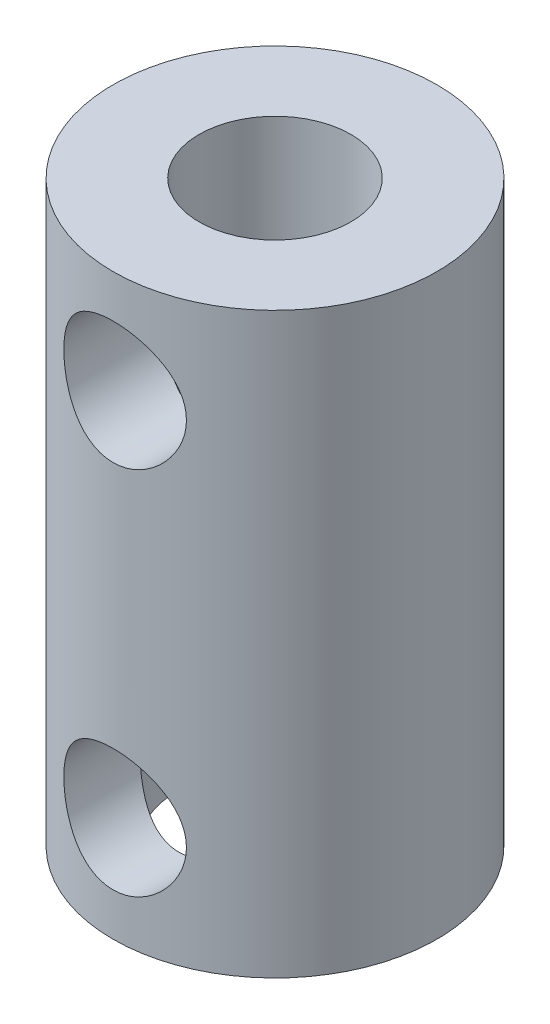
ISO-10303-21;
HEADER;
FILE_DESCRIPTION(('STEP AP214'),'2;1');
FILE_NAME('part.step','',(''),(''),'','','');
FILE_SCHEMA(('AUTOMOTIVE_DESIGN { 1 0 10303 214 1 1 1 1 }'));
ENDSEC;
DATA;
#1=APPLICATION_CONTEXT('core data for automotive mechanical design processes');
#2=APPLICATION_PROTOCOL_DEFINITION('international standard','automotive_design',2000,#1);
#3=PRODUCT_CONTEXT('',#1,'mechanical');
#4=PRODUCT('Part','Part','',(#3));
#5=PRODUCT_RELATED_PRODUCT_CATEGORY('part','',(#4));
#6=PRODUCT_DEFINITION_FORMATION('','',#4);
#7=PRODUCT_DEFINITION_CONTEXT('part definition',#1,'design');
#8=PRODUCT_DEFINITION('design','',#6,#7);
#9=PRODUCT_DEFINITION_SHAPE('','',#8);
#10=(LENGTH_UNIT() NAMED_UNIT(*) SI_UNIT(.MILLI.,.METRE.));
#11=(NAMED_UNIT(*) PLANE_ANGLE_UNIT() SI_UNIT($,.RADIAN.));
#12=(NAMED_UNIT(*) SI_UNIT($,.STERADIAN.) SOLID_ANGLE_UNIT());
#13=UNCERTAINTY_MEASURE_WITH_UNIT(LENGTH_MEASURE(1.E-05),#10,'distance_accuracy_value','');
#14=(GEOMETRIC_REPRESENTATION_CONTEXT(3) GLOBAL_UNCERTAINTY_ASSIGNED_CONTEXT((#13)) GLOBAL_UNIT_ASSIGNED_CONTEXT((#10,
#11,#12)) REPRESENTATION_CONTEXT('',''));
#15=CARTESIAN_POINT('',(0.,0.,0.));
#16=DIRECTION('',(0.,0.,1.));
#17=DIRECTION('',(1.,0.,0.));
#18=AXIS2_PLACEMENT_3D('',#15,#16,#17);
#19=CARTESIAN_POINT('',(0.,19.05,0.));
#20=DIRECTION('',(0.,-1.,0.));
#21=DIRECTION('',(0.,0.,-1.));
#22=AXIS2_PLACEMENT_3D('',#19,#20,#21);
#23=CYLINDRICAL_SURFACE('',#22,5.334);
#24=CARTESIAN_POINT('',(2.01929999999999,3.429,4.93700146951568));
#25=CARTESIAN_POINT('',(2.01930447944565,3.53796644205671,4.93699724405046));
#26=CARTESIAN_POINT('',(2.01045059439056,3.64690370553361,4.94064814854933));
#27=CARTESIAN_POINT('',(1.97543444054489,3.86148882864372,4.95475201963925));
#28=CARTESIAN_POINT('',(1.94927294682313,3.96713683535452,4.96520468163385));
#29=CARTESIAN_POINT('',(1.88074304619809,4.17198278347489,4.99156194094386));
#30=CARTESIAN_POINT('',(1.83841414033231,4.2711957615293,5.00745324054417));
#31=CARTESIAN_POINT('',(1.73889128334471,4.46115102344321,5.04287560500619));
#32=CARTESIAN_POINT('',(1.6816927775262,4.55189070025616,5.06240778458365));
#33=CARTESIAN_POINT('',(1.55095007886271,4.7269220295397,5.10401994332031));
#34=CARTESIAN_POINT('',(1.47677408325426,4.81072382075372,5.12617585427608));
#35=CARTESIAN_POINT('',(1.31552180232292,4.96504478705856,5.16990629793248));
#36=CARTESIAN_POINT('',(1.2284427045076,5.0355610586704,5.19148070266726));
#37=CARTESIAN_POINT('',(1.04012523794396,5.16368183766763,5.23252204526852));
#38=CARTESIAN_POINT('',(0.938499803257827,5.22075210244006,5.25188961400418));
#39=CARTESIAN_POINT('',(0.726227423158126,5.31678227445568,5.28542063488425));
#40=CARTESIAN_POINT('',(0.615583687488662,5.35574859235797,5.29958592879611));
#41=CARTESIAN_POINT('',(0.393566749542693,5.41274137724498,5.32057718322424));
#42=CARTESIAN_POINT('',(0.282438553669896,5.43161158643117,5.32769789450095));
#43=CARTESIAN_POINT('',(0.0583798398278733,5.45058184692518,5.33485652895422));
#44=CARTESIAN_POINT('',(-0.0545500684528993,5.45068811853213,5.33489679931724));
#45=CARTESIAN_POINT('',(-0.272951762873949,5.43261481136873,5.32807636219454));
#46=CARTESIAN_POINT('',(-0.378512558081566,5.41535666378981,5.32156339727964));
#47=CARTESIAN_POINT('',(-0.585111251091154,5.36459681820008,5.30282614548131));
#48=CARTESIAN_POINT('',(-0.686148827388547,5.33109396753274,5.29060145331974));
#49=CARTESIAN_POINT('',(-0.882591199788239,5.24837714092316,5.26142589156488));
#50=CARTESIAN_POINT('',(-0.977891853376849,5.19894029486581,5.24440843901689));
#51=CARTESIAN_POINT('',(-1.15908281530852,5.08595760716204,5.20736477295068));
#52=CARTESIAN_POINT('',(-1.24497004337341,5.02240716770396,5.18733757963256));
#53=CARTESIAN_POINT('',(-1.41031734945089,4.87858128309122,5.14492730665769));
#54=CARTESIAN_POINT('',(-1.48909060289719,4.79753549367529,5.12247495361345));
#55=CARTESIAN_POINT('',(-1.63218972233639,4.62325577623301,5.07869327063848));
#56=CARTESIAN_POINT('',(-1.69651181554814,4.53001867543433,5.05736423508365));
#57=CARTESIAN_POINT('',(-1.81023010786301,4.33124303399592,5.01780263958016));
#58=CARTESIAN_POINT('',(-1.85924901990288,4.22547089829707,4.99965257367589));
#59=CARTESIAN_POINT('',(-1.93851753880741,4.00630460921826,4.96945937974622));
#60=CARTESIAN_POINT('',(-1.96877783080307,3.89291483581017,4.95741277583277));
#61=CARTESIAN_POINT('',(-2.0080927254921,3.66852916571396,4.94161372576153));
#62=CARTESIAN_POINT('',(-2.01824049485177,3.55775511724918,4.93743437273379));
#63=CARTESIAN_POINT('',(-2.02020093934924,3.33603239846786,4.93663342024542));
#64=CARTESIAN_POINT('',(-2.01201832383527,3.22508378031911,4.94000987958409));
#65=CARTESIAN_POINT('',(-1.97854205652086,3.01183186914766,4.95350589275915));
#66=CARTESIAN_POINT('',(-1.95410194104481,2.90937078397479,4.96328872527596));
#67=CARTESIAN_POINT('',(-1.88988298600506,2.71005348440489,4.98809328378995));
#68=CARTESIAN_POINT('',(-1.85010096750629,2.61319843639933,5.00311609548081));
#69=CARTESIAN_POINT('',(-1.75463072385412,2.42375373533398,5.03740860205377));
#70=CARTESIAN_POINT('',(-1.69839621410485,2.3314653892027,5.05681781536739));
#71=CARTESIAN_POINT('',(-1.57219523321136,2.15724747101338,5.09746480725639));
#72=CARTESIAN_POINT('',(-1.50222365366067,2.07532177120689,5.11870326441882));
#73=CARTESIAN_POINT('',(-1.34516894631352,1.91864380219287,5.16227937258415));
#74=CARTESIAN_POINT('',(-1.25727058071108,1.84470087388889,5.18459902436317));
#75=CARTESIAN_POINT('',(-1.06976739053702,1.71251372859965,5.22650650196036));
#76=CARTESIAN_POINT('',(-0.970162473418255,1.65426963573486,5.24609430617899));
#77=CARTESIAN_POINT('',(-0.762084546055993,1.55549649159357,5.28032694944767));
#78=CARTESIAN_POINT('',(-0.65363967819728,1.51491364331945,5.29498676788628));
#79=CARTESIAN_POINT('',(-0.430779322695874,1.45280032542776,5.31775366325145));
#80=CARTESIAN_POINT('',(-0.316366729446474,1.43126070903253,5.32586388589443));
#81=CARTESIAN_POINT('',(-0.0921269840688143,1.40884562792458,5.33431446661301));
#82=CARTESIAN_POINT('',(0.0175700260696666,1.40682107157147,5.33508685186249));
#83=CARTESIAN_POINT('',(0.23567589035579,1.42052681410102,5.32990684279753));
#84=CARTESIAN_POINT('',(0.344084903230242,1.43625490180729,5.32395528598201));
#85=CARTESIAN_POINT('',(0.553754325491232,1.48421010250464,5.3061959436016));
#86=CARTESIAN_POINT('',(0.655126105044459,1.5160107376975,5.29453976881732));
#87=CARTESIAN_POINT('',(0.851099804673821,1.594780504935,5.26659215506921));
#88=CARTESIAN_POINT('',(0.945700438435498,1.64175250979098,5.2502998382871));
#89=CARTESIAN_POINT('',(1.12984126460486,1.75179421046231,5.21384686801513));
#90=CARTESIAN_POINT('',(1.21899691290268,1.81546192263802,5.19355150342232));
#91=CARTESIAN_POINT('',(1.38571137675006,1.9561510808879,5.15157869080139));
#92=CARTESIAN_POINT('',(1.46326600313846,2.03317732918966,5.1299007475314));
#93=CARTESIAN_POINT('',(1.60889417238222,2.20334295835456,5.08616858438968));
#94=CARTESIAN_POINT('',(1.67622898493519,2.29712810269221,5.06415732477682));
#95=CARTESIAN_POINT('',(1.79422016325732,2.49537615296483,5.02356822261871));
#96=CARTESIAN_POINT('',(1.84487417660335,2.59984056223187,5.0049908645041));
#97=CARTESIAN_POINT('',(1.92989734602869,2.82239312636753,4.97285117373348));
#98=CARTESIAN_POINT('',(1.96328114135574,2.94090744590317,4.9596003647767));
#99=CARTESIAN_POINT('',(2.00797225124147,3.18262915575414,4.94168088836879));
#100=CARTESIAN_POINT('',(2.01929493679981,3.30583321744351,4.93700624563709));
#101=CARTESIAN_POINT('',(2.01929999999999,3.429,4.93700146951568));
#102=B_SPLINE_CURVE_WITH_KNOTS('',3,(#24,#25,#26,#27,#28,#29,#30,#31,#32,#33,#34,#35,#36,#37,
#38,#39,#40,#41,#42,#43,#44,#45,#46,#47,#48,#49,#50,#51,#52,#53,#54,#55,#56,#57,#58,#59,#60,#61,
#62,#63,#64,#65,#66,#67,#68,#69,#70,#71,#72,#73,#74,#75,#76,#77,#78,#79,#80,#81,#82,#83,#84,#85,
#86,#87,#88,#89,#90,#91,#92,#93,#94,#95,#96,#97,#98,#99,#100,#101),.UNSPECIFIED.,.T.,.F.,(4,2,2,
2,2,2,2,2,2,2,2,2,2,2,2,2,2,2,2,2,2,2,2,2,2,2,2,2,2,2,2,2,2,2,2,2,2,2,4),(0.,0.326440462933104,
0.652866308208239,0.97849966296616,1.30423288001533,1.64497726295524,1.98579602758814,
2.33846601182069,2.69101101924979,3.02808777213957,3.36505278290879,3.68503301877184,
4.00503596242417,4.32972461584071,4.65451919925019,4.99864582719999,5.34286219255829,
5.69499486283583,6.0469267694459,6.37913973630183,6.71126736249901,7.02720512429604,
7.34320838551137,7.67120245546789,7.99931872846166,8.3487060328166,8.69809609946859,
9.04641432838319,9.39456516328478,9.72208120206034,10.0495564516543,10.3687657960398,
10.6880356205532,11.0208403418839,11.3537649513074,11.7046787209908,12.0556419573988,
12.4248810015916,12.793862687667),.UNSPECIFIED.);
#103=CARTESIAN_POINT('',(2.01929999999999,3.429,4.93700146951568));
#104=VERTEX_POINT('',#103);
#105=EDGE_CURVE('E118',#104,#104,#102,.T.);
#106=ORIENTED_EDGE('',*,*,#105,.F.);
#107=EDGE_LOOP('',(#106));
#108=FACE_BOUND('',#107,.T.);
#109=CARTESIAN_POINT('',(2.01929999999999,15.621,4.93700146951568));
#110=CARTESIAN_POINT('',(2.01930447944565,15.7299664420567,4.93699724405046));
#111=CARTESIAN_POINT('',(2.01045059439056,15.8389037055336,4.94064814854933));
#112=CARTESIAN_POINT('',(1.97543444054489,16.0534888286437,4.95475201963925));
#113=CARTESIAN_POINT('',(1.94927294682313,16.1591368353545,4.96520468163385));
#114=CARTESIAN_POINT('',(1.88074304619809,16.3639827834749,4.99156194094386));
#115=CARTESIAN_POINT('',(1.83841414033231,16.4631957615293,5.00745324054417));
#116=CARTESIAN_POINT('',(1.73889128334471,16.6531510234432,5.04287560500619));
#117=CARTESIAN_POINT('',(1.68169277752621,16.7438907002562,5.06240778458365));
#118=CARTESIAN_POINT('',(1.55095007886271,16.9189220295397,5.1040199433203));
#119=CARTESIAN_POINT('',(1.47677408325426,17.0027238207537,5.12617585427608));
#120=CARTESIAN_POINT('',(1.31552180232293,17.1570447870586,5.16990629793248));
#121=CARTESIAN_POINT('',(1.22844270450761,17.2275610586704,5.19148070266726));
#122=CARTESIAN_POINT('',(1.04012523794396,17.3556818376676,5.23252204526852));
#123=CARTESIAN_POINT('',(0.938499803257828,17.4127521024401,5.25188961400418));
#124=CARTESIAN_POINT('',(0.726227423158127,17.5087822744557,5.28542063488425));
#125=CARTESIAN_POINT('',(0.615583687488664,17.547748592358,5.29958592879611));
#126=CARTESIAN_POINT('',(0.393566749542695,17.604741377245,5.32057718322424));
#127=CARTESIAN_POINT('',(0.282438553669898,17.6236115864312,5.32769789450094));
#128=CARTESIAN_POINT('',(0.0583798398278744,17.6425818469252,5.33485652895422));
#129=CARTESIAN_POINT('',(-0.0545500684528987,17.6426881185321,5.33489679931724));
#130=CARTESIAN_POINT('',(-0.272951762873949,17.6246148113687,5.32807636219454));
#131=CARTESIAN_POINT('',(-0.378512558081566,17.6073566637898,5.32156339727964));
#132=CARTESIAN_POINT('',(-0.585111251091155,17.5565968182001,5.30282614548131));
#133=CARTESIAN_POINT('',(-0.686148827388547,17.5230939675327,5.29060145331974));
#134=CARTESIAN_POINT('',(-0.882591199788239,17.4403771409232,5.26142589156488));
#135=CARTESIAN_POINT('',(-0.977891853376849,17.3909402948658,5.24440843901689));
#136=CARTESIAN_POINT('',(-1.15908281530852,17.277957607162,5.20736477295068));
#137=CARTESIAN_POINT('',(-1.24497004337341,17.214407167704,5.18733757963256));
#138=CARTESIAN_POINT('',(-1.41031734945089,17.0705812830912,5.14492730665769));
#139=CARTESIAN_POINT('',(-1.48909060289719,16.9895354936753,5.12247495361345));
#140=CARTESIAN_POINT('',(-1.63218972233639,16.815255776233,5.07869327063848));
#141=CARTESIAN_POINT('',(-1.69651181554814,16.7220186754343,5.05736423508365));
#142=CARTESIAN_POINT('',(-1.81023010786301,16.5232430339959,5.01780263958016));
#143=CARTESIAN_POINT('',(-1.85924901990288,16.4174708982971,4.99965257367589));
#144=CARTESIAN_POINT('',(-1.93851753880741,16.1983046092183,4.96945937974622));
#145=CARTESIAN_POINT('',(-1.96877783080307,16.0849148358102,4.95741277583277));
#146=CARTESIAN_POINT('',(-2.0080927254921,15.860529165714,4.94161372576153));
#147=CARTESIAN_POINT('',(-2.01824049485177,15.7497551172492,4.93743437273379));
#148=CARTESIAN_POINT('',(-2.02020093934924,15.5280323984679,4.93663342024542));
#149=CARTESIAN_POINT('',(-2.01201832383527,15.4170837803191,4.94000987958409));
#150=CARTESIAN_POINT('',(-1.97854205652086,15.2038318691477,4.95350589275915));
#151=CARTESIAN_POINT('',(-1.95410194104481,15.1013707839748,4.96328872527596));
#152=CARTESIAN_POINT('',(-1.88988298600506,14.9020534844049,4.98809328378994));
#153=CARTESIAN_POINT('',(-1.85010096750629,14.8051984363993,5.00311609548081));
#154=CARTESIAN_POINT('',(-1.75463072385412,14.615753735334,5.03740860205377));
#155=CARTESIAN_POINT('',(-1.69839621410485,14.5234653892027,5.05681781536739));
#156=CARTESIAN_POINT('',(-1.57219523321136,14.3492474710134,5.09746480725639));
#157=CARTESIAN_POINT('',(-1.50222365366067,14.2673217712069,5.11870326441882));
#158=CARTESIAN_POINT('',(-1.34516894631352,14.1106438021929,5.16227937258415));
#159=CARTESIAN_POINT('',(-1.25727058071108,14.0367008738889,5.18459902436317));
#160=CARTESIAN_POINT('',(-1.06976739053702,13.9045137285996,5.22650650196036));
#161=CARTESIAN_POINT('',(-0.970162473418255,13.8462696357349,5.24609430617899));
#162=CARTESIAN_POINT('',(-0.762084546055994,13.7474964915936,5.28032694944767));
#163=CARTESIAN_POINT('',(-0.65363967819728,13.7069136433194,5.29498676788628));
#164=CARTESIAN_POINT('',(-0.430779322695874,13.6448003254278,5.31775366325145));
#165=CARTESIAN_POINT('',(-0.316366729446474,13.6232607090325,5.32586388589443));
#166=CARTESIAN_POINT('',(-0.0921269840688128,13.6008456279246,5.33431446661301));
#167=CARTESIAN_POINT('',(0.0175700260696684,13.5988210715715,5.33508685186249));
#168=CARTESIAN_POINT('',(0.235675890355791,13.612526814101,5.32990684279753));
#169=CARTESIAN_POINT('',(0.344084903230242,13.6282549018073,5.32395528598201));
#170=CARTESIAN_POINT('',(0.553754325491233,13.6762101025046,5.3061959436016));
#171=CARTESIAN_POINT('',(0.655126105044461,13.7080107376975,5.29453976881732));
#172=CARTESIAN_POINT('',(0.851099804673823,13.786780504935,5.26659215506921));
#173=CARTESIAN_POINT('',(0.945700438435499,13.833752509791,5.2502998382871));
#174=CARTESIAN_POINT('',(1.12984126460486,13.9437942104623,5.21384686801513));
#175=CARTESIAN_POINT('',(1.21899691290268,14.007461922638,5.19355150342232));
#176=CARTESIAN_POINT('',(1.38571137675006,14.1481510808879,5.15157869080139));
#177=CARTESIAN_POINT('',(1.46326600313847,14.2251773291897,5.1299007475314));
#178=CARTESIAN_POINT('',(1.60889417238223,14.3953429583546,5.08616858438968));
#179=CARTESIAN_POINT('',(1.67622898493519,14.4891281026922,5.06415732477682));
#180=CARTESIAN_POINT('',(1.79422016325732,14.6873761529648,5.02356822261871));
#181=CARTESIAN_POINT('',(1.84487417660335,14.7918405622319,5.0049908645041));
#182=CARTESIAN_POINT('',(1.92989734602869,15.0143931263675,4.97285117373348));
#183=CARTESIAN_POINT('',(1.96328114135574,15.1329074459032,4.9596003647767));
#184=CARTESIAN_POINT('',(2.00797225124147,15.3746291557541,4.94168088836879));
#185=CARTESIAN_POINT('',(2.01929493679981,15.4978332174435,4.93700624563709));
#186=CARTESIAN_POINT('',(2.01929999999999,15.621,4.93700146951568));
#187=B_SPLINE_CURVE_WITH_KNOTS('',3,(#109,#110,#111,#112,#113,#114,#115,#116,#117,#118,#119,
#120,#121,#122,#123,#124,#125,#126,#127,#128,#129,#130,#131,#132,#133,#134,#135,#136,#137,#138,
#139,#140,#141,#142,#143,#144,#145,#146,#147,#148,#149,#150,#151,#152,#153,#154,#155,#156,#157,
#158,#159,#160,#161,#162,#163,#164,#165,#166,#167,#168,#169,#170,#171,#172,#173,#174,#175,#176,
#177,#178,#179,#180,#181,#182,#183,#184,#185,#186),.UNSPECIFIED.,.T.,.F.,(4,2,2,2,2,2,2,2,2,2,2,
2,2,2,2,2,2,2,2,2,2,2,2,2,2,2,2,2,2,2,2,2,2,2,2,2,2,2,4),(0.,0.326440462933099,
0.652866308208239,0.978499662966158,1.30423288001532,1.64497726295524,1.98579602758814,
2.33846601182068,2.69101101924979,3.02808777213956,3.36505278290879,3.68503301877184,
4.00503596242417,4.32972461584071,4.65451919925019,4.99864582719999,5.34286219255829,
5.69499486283583,6.04692676944589,6.37913973630183,6.71126736249901,7.02720512429604,
7.34320838551137,7.6712024554679,7.99931872846166,8.3487060328166,8.69809609946859,
9.04641432838319,9.39456516328478,9.72208120206034,10.0495564516543,10.3687657960398,
10.6880356205532,11.0208403418839,11.3537649513074,11.7046787209908,12.0556419573988,
12.4248810015916,12.793862687667),.UNSPECIFIED.);
#188=CARTESIAN_POINT('',(2.01929999999999,15.621,4.93700146951568));
#189=VERTEX_POINT('',#188);
#190=EDGE_CURVE('E59',#189,#189,#187,.T.);
#191=ORIENTED_EDGE('',*,*,#190,.F.);
#192=EDGE_LOOP('',(#191));
#193=FACE_BOUND('',#192,.T.);
#194=CARTESIAN_POINT('',(0.,19.05,0.));
#195=DIRECTION('',(0.,-1.,0.));
#196=DIRECTION('',(0.,0.,-1.));
#197=AXIS2_PLACEMENT_3D('',#194,#195,#196);
#198=CIRCLE('',#197,5.334);
#199=CARTESIAN_POINT('',(0.,19.05,-5.334));
#200=VERTEX_POINT('',#199);
#201=EDGE_CURVE('E10',#200,#200,#198,.T.);
#202=ORIENTED_EDGE('',*,*,#201,.T.);
#203=EDGE_LOOP('',(#202));
#204=FACE_BOUND('',#203,.T.);
#205=CARTESIAN_POINT('',(0.,0.,0.));
#206=DIRECTION('',(0.,-1.,0.));
#207=DIRECTION('',(0.,0.,-1.));
#208=AXIS2_PLACEMENT_3D('',#205,#206,#207);
#209=CIRCLE('',#208,5.334);
#210=CARTESIAN_POINT('',(0.,0.,-5.334));
#211=VERTEX_POINT('',#210);
#212=EDGE_CURVE('E40',#211,#211,#209,.T.);
#213=ORIENTED_EDGE('',*,*,#212,.F.);
#214=EDGE_LOOP('',(#213));
#215=FACE_BOUND('',#214,.T.);
#216=ADVANCED_FACE('F33',(#108,#193,#204,#215),#23,.T.);
#217=CARTESIAN_POINT('',(5.334,19.05,0.));
#218=DIRECTION('',(0.,1.,0.));
#219=DIRECTION('',(0.,0.,1.));
#220=AXIS2_PLACEMENT_3D('',#217,#218,#219);
#221=PLANE('',#220);
#222=CARTESIAN_POINT('',(0.,19.05,0.));
#223=DIRECTION('',(0.,-1.,0.));
#224=DIRECTION('',(0.,0.,-1.));
#225=AXIS2_PLACEMENT_3D('',#222,#223,#224);
#226=CIRCLE('',#225,2.5);
#227=CARTESIAN_POINT('',(0.,19.05,-2.5));
#228=VERTEX_POINT('',#227);
#229=EDGE_CURVE('E44',#228,#228,#226,.T.);
#230=ORIENTED_EDGE('',*,*,#229,.T.);
#231=EDGE_LOOP('',(#230));
#232=FACE_BOUND('',#231,.T.);
#233=ORIENTED_EDGE('',*,*,#201,.F.);
#234=EDGE_LOOP('',(#233));
#235=FACE_BOUND('',#234,.T.);
#236=ADVANCED_FACE('F95',(#232,#235),#221,.T.);
#237=CARTESIAN_POINT('',(0.,0.,0.));
#238=DIRECTION('',(0.,-1.,0.));
#239=DIRECTION('',(0.,0.,-1.));
#240=AXIS2_PLACEMENT_3D('',#237,#238,#239);
#241=PLANE('',#240);
#242=CARTESIAN_POINT('',(0.,0.,0.));
#243=DIRECTION('',(0.,-1.,0.));
#244=DIRECTION('',(0.,0.,-1.));
#245=AXIS2_PLACEMENT_3D('',#242,#243,#244);
#246=CIRCLE('',#245,3.17499999999999);
#247=CARTESIAN_POINT('',(0.,0.,-3.17499999999999));
#248=VERTEX_POINT('',#247);
#249=EDGE_CURVE('E56',#248,#248,#246,.T.);
#250=ORIENTED_EDGE('',*,*,#249,.F.);
#251=EDGE_LOOP('',(#250));
#252=FACE_BOUND('',#251,.T.);
#253=ORIENTED_EDGE('',*,*,#212,.T.);
#254=EDGE_LOOP('',(#253));
#255=FACE_BOUND('',#254,.T.);
#256=ADVANCED_FACE('F92',(#252,#255),#241,.T.);
#257=CARTESIAN_POINT('',(0.,0.,0.));
#258=DIRECTION('',(0.,-1.,0.));
#259=DIRECTION('',(0.,0.,-1.));
#260=AXIS2_PLACEMENT_3D('',#257,#258,#259);
#261=CYLINDRICAL_SURFACE('',#260,2.5);
#262=CARTESIAN_POINT('',(2.01929999999999,15.621,1.473915706545));
#263=CARTESIAN_POINT('',(2.01929480722155,15.695817152673,1.47392817298036));
#264=CARTESIAN_POINT('',(2.01509305438287,15.770758738327,1.47973177177315));
#265=CARTESIAN_POINT('',(1.99869205773919,15.9182527876197,1.50179953959201));
#266=CARTESIAN_POINT('',(1.98646694346137,15.9907967228186,1.51809754348625));
#267=CARTESIAN_POINT('',(1.9492780717501,16.1572237109829,1.56572883433403));
#268=CARTESIAN_POINT('',(1.92132304975766,16.2494666351095,1.60035394837302));
#269=CARTESIAN_POINT('',(1.85422314092621,16.4262492339265,1.67764101224755));
#270=CARTESIAN_POINT('',(1.81504489951149,16.5107649412816,1.72032678694469));
#271=CARTESIAN_POINT('',(1.74026753050541,16.647187087901,1.79536950883741));
#272=CARTESIAN_POINT('',(1.70732483369805,16.7010795548549,1.82682556730138));
#273=CARTESIAN_POINT('',(1.63673711570053,16.8053275734456,1.8903305612507));
#274=CARTESIAN_POINT('',(1.59909033781284,16.8556817927219,1.92237971439296));
#275=CARTESIAN_POINT('',(1.4792654443613,17.0012662951321,2.017961614084));
#276=CARTESIAN_POINT('',(1.39008353685323,17.0912350977392,2.08105533247437));
#277=CARTESIAN_POINT('',(1.2133292385467,17.2383523323418,2.18775655279473));
#278=CARTESIAN_POINT('',(1.12903037750066,17.2984634128109,2.23273276258079));
#279=CARTESIAN_POINT('',(0.949376709043427,17.4062687543222,2.31481868022346));
#280=CARTESIAN_POINT('',(0.854039558710228,17.4539824603778,2.35194069002827));
#281=CARTESIAN_POINT('',(0.67032627149894,17.527925581788,2.41005502549929));
#282=CARTESIAN_POINT('',(0.58337864442608,17.5563965314886,2.43269514678688));
#283=CARTESIAN_POINT('',(0.404602004181709,17.6014921566258,2.46872242982194));
#284=CARTESIAN_POINT('',(0.312775724850328,17.618123392964,2.48211471607454));
#285=CARTESIAN_POINT('',(0.126426992802872,17.6385236671229,2.4985580350246));
#286=CARTESIAN_POINT('',(0.0318960123591591,17.6422461116475,2.50157160627638));
#287=CARTESIAN_POINT('',(-0.1564861731022,17.6364316376802,2.49687588189192));
#288=CARTESIAN_POINT('',(-0.250337360108224,17.626894369145,2.48916630317513));
#289=CARTESIAN_POINT('',(-0.429140532047276,17.5961390241307,2.46445221174764));
#290=CARTESIAN_POINT('',(-0.514294277979382,17.5756217271112,2.44800573548022));
#291=CARTESIAN_POINT('',(-0.679541017418277,17.5244927412796,2.40737862535811));
#292=CARTESIAN_POINT('',(-0.759632705918598,17.4938784619963,2.38319600677465));
#293=CARTESIAN_POINT('',(-0.920770446303677,17.4205321075079,2.32597640251123));
#294=CARTESIAN_POINT('',(-1.00119655018714,17.3769305807205,2.29232018371873));
#295=CARTESIAN_POINT('',(-1.153695056202,17.2807292583919,2.21949122380963));
#296=CARTESIAN_POINT('',(-1.22576310006027,17.2281248033922,2.18031562800905));
#297=CARTESIAN_POINT('',(-1.37523874956472,17.1034407160834,2.08993667695684));
#298=CARTESIAN_POINT('',(-1.45066899230469,17.0295832657084,2.03792128952945));
#299=CARTESIAN_POINT('',(-1.58880440740247,16.8717195492242,1.9321670528221));
#300=CARTESIAN_POINT('',(-1.65149250594816,16.7876999034864,1.87842600138097));
#301=CARTESIAN_POINT('',(-1.75958628758068,16.6164495324485,1.77733312807007));
#302=CARTESIAN_POINT('',(-1.80592689536945,16.5299151636252,1.72980265406421));
#303=CARTESIAN_POINT('',(-1.8864585351309,16.348110486566,1.64159022044208));
#304=CARTESIAN_POINT('',(-1.92067607919657,16.2528598218056,1.60089342007614));
#305=CARTESIAN_POINT('',(-1.96632640337569,16.0857790923626,1.54416456673683));
#306=CARTESIAN_POINT('',(-1.98154800109557,16.0162803084664,1.52440993985532));
#307=CARTESIAN_POINT('',(-2.00464734514039,15.8742077176853,1.4939085692843));
#308=CARTESIAN_POINT('',(-2.01254234645966,15.8016415588115,1.48314066686152));
#309=CARTESIAN_POINT('',(-2.02036345833571,15.6547431789786,1.47247617440034));
#310=CARTESIAN_POINT('',(-2.02023580156782,15.5804023808004,1.47265293465196));
#311=CARTESIAN_POINT('',(-2.01188939337809,15.4330009922396,1.48402871659748));
#312=CARTESIAN_POINT('',(-2.00365994622032,15.3599422241304,1.4952423087744));
#313=CARTESIAN_POINT('',(-1.97703934818401,15.2004318643912,1.53032338883687));
#314=CARTESIAN_POINT('',(-1.95672334209332,15.1148389545399,1.55653509298973));
#315=CARTESIAN_POINT('',(-1.90644977534374,14.949798036919,1.61771969357756));
#316=CARTESIAN_POINT('',(-1.87646281040626,14.8703696980278,1.65271923638022));
#317=CARTESIAN_POINT('',(-1.79115590372931,14.6803121833082,1.74568689316358));
#318=CARTESIAN_POINT('',(-1.73061991204155,14.5734334484584,1.80651395789614));
#319=CARTESIAN_POINT('',(-1.59198575897704,14.3727918475522,1.92983341880176));
#320=CARTESIAN_POINT('',(-1.51386486189691,14.2790462182822,1.99232787773044));
#321=CARTESIAN_POINT('',(-1.33868834736263,14.104066758993,2.1141237030724));
#322=CARTESIAN_POINT('',(-1.24130762020883,14.0230980313765,2.17334407438492));
#323=CARTESIAN_POINT('',(-1.0292452272508,13.8790096958363,2.28138266596993));
#324=CARTESIAN_POINT('',(-0.914620369699263,13.8158333667187,2.33023381719762));
#325=CARTESIAN_POINT('',(-0.709566917792887,13.7283170012323,2.3987919083807));
#326=CARTESIAN_POINT('',(-0.623112377750105,13.6980179447815,2.42282352422953));
#327=CARTESIAN_POINT('',(-0.444963359276082,13.6491772827753,2.46176594276952));
#328=CARTESIAN_POINT('',(-0.353272974959085,13.6306266242872,2.47668376793679));
#329=CARTESIAN_POINT('',(-0.166706055375658,13.6063874966507,2.49620492264458));
#330=CARTESIAN_POINT('',(-0.0718178514248729,13.6007528608993,2.50076508118314));
#331=CARTESIAN_POINT('',(0.117708056155678,13.6029078703976,2.49902432329807));
#332=CARTESIAN_POINT('',(0.21234576099742,13.6106974505783,2.49272345951928));
#333=CARTESIAN_POINT('',(0.392478798314735,13.6382447811681,2.47056373925411));
#334=CARTESIAN_POINT('',(0.478175060631235,13.6572203267739,2.45532988066348));
#335=CARTESIAN_POINT('',(0.644740829759782,13.7054305181875,2.41694473259868));
#336=CARTESIAN_POINT('',(0.725609068995025,13.734667844443,2.39379137453718));
#337=CARTESIAN_POINT('',(0.887671111373459,13.8049454071109,2.33879505673711));
#338=CARTESIAN_POINT('',(0.968331731435918,13.8467655117114,2.30638921826432));
#339=CARTESIAN_POINT('',(1.12154463098484,13.9394123343552,2.23590280226766));
#340=CARTESIAN_POINT('',(1.19409338451914,13.9902429443311,2.19781977371435));
#341=CARTESIAN_POINT('',(1.34451441899108,14.1107261746447,2.10981567153515));
#342=CARTESIAN_POINT('',(1.42050802965211,14.1821071927176,2.05905632923989));
#343=CARTESIAN_POINT('',(1.56016448165252,14.334845763169,1.9553665919813));
#344=CARTESIAN_POINT('',(1.62380894191178,14.4162178973091,1.90243310066322));
#345=CARTESIAN_POINT('',(1.73723779994473,14.5866620415423,1.79937292606237));
#346=CARTESIAN_POINT('',(1.78728237313723,14.6755392611519,1.74921079366599));
#347=CARTESIAN_POINT('',(1.87436590683737,14.8627524415187,1.65554058689662));
#348=CARTESIAN_POINT('',(1.91142967284722,14.9610698991632,1.61201991196286));
#349=CARTESIAN_POINT('',(1.96080868074273,15.1331873385134,1.55120482828878));
#350=CARTESIAN_POINT('',(1.97725454143049,15.2043911729556,1.52999393395851));
#351=CARTESIAN_POINT('',(2.00240730513945,15.3501629041127,1.49693379349098));
#352=CARTESIAN_POINT('',(2.01114425218012,15.4247165401613,1.48504822393772));
#353=CARTESIAN_POINT('',(2.01687486699648,15.5200111253367,1.47723289234643));
#354=CARTESIAN_POINT('',(2.01778274194707,15.5401738768274,1.47599261432345));
#355=CARTESIAN_POINT('',(2.01899607356419,15.5805547133913,1.47433225023716));
#356=CARTESIAN_POINT('',(2.01930140389357,15.600772809179,1.47391233618195));
#357=CARTESIAN_POINT('',(2.01929999999999,15.621,1.473915706545));
#358=B_SPLINE_CURVE_WITH_KNOTS('',3,(#262,#263,#264,#265,#266,#267,#268,#269,#270,#271,#272,
#273,#274,#275,#276,#277,#278,#279,#280,#281,#282,#283,#284,#285,#286,#287,#288,#289,#290,#291,
#292,#293,#294,#295,#296,#297,#298,#299,#300,#301,#302,#303,#304,#305,#306,#307,#308,#309,#310,
#311,#312,#313,#314,#315,#316,#317,#318,#319,#320,#321,#322,#323,#324,#325,#326,#327,#328,#329,
#330,#331,#332,#333,#334,#335,#336,#337,#338,#339,#340,#341,#342,#343,#344,#345,#346,#347,#348,
#349,#350,#351,#352,#353,#354,#355,#356,#357),.UNSPECIFIED.,.T.,.F.,(4,2,2,2,2,2,2,2,2,2,2,2,2,
2,2,2,2,2,2,2,2,2,2,2,2,2,2,2,2,2,2,2,2,2,2,2,2,2,2,2,2,2,2,2,2,2,2,4),(0.,0.224362322740664,
0.449451655704626,0.75499047854588,1.06144693177859,1.27288816827714,1.48440860295582,
1.90662570812593,2.24405113823281,2.58094408468372,2.86250451322325,3.1439087951397,
3.42632773306912,3.70875412672087,3.97499404894986,4.24130233062072,4.5326807236232,
4.82421037786789,5.17602246669959,5.52830290218206,5.85454510821446,6.18006938162417,
6.4008027948085,6.62101502570859,6.84270326080861,7.0646845549295,7.33852607700983,
7.61320818271303,8.02229646515855,8.43191673133523,8.84915467219724,9.26504702290815,
9.54802932993571,9.83079331385018,10.1147337188709,10.3986727475979,10.6647829745165,
10.9309627630469,11.2192984509036,11.5077589852118,11.8544132462528,12.2015795916085,
12.5415427910607,12.8808527514879,13.1083575134694,13.3349716520162,13.3956164121122,
13.4562738864078),.UNSPECIFIED.);
#359=CARTESIAN_POINT('',(2.01929999999999,15.621,1.473915706545));
#360=VERTEX_POINT('',#359);
#361=EDGE_CURVE('E65',#360,#360,#358,.T.);
#362=ORIENTED_EDGE('',*,*,#361,.T.);
#363=EDGE_LOOP('',(#362));
#364=FACE_BOUND('',#363,.T.);
#365=ORIENTED_EDGE('',*,*,#229,.F.);
#366=EDGE_LOOP('',(#365));
#367=FACE_BOUND('',#366,.T.);
#368=CARTESIAN_POINT('',(0.,9.93058091779916,0.));
#369=DIRECTION('',(0.,-1.,0.));
#370=DIRECTION('',(0.,0.,-1.));
#371=AXIS2_PLACEMENT_3D('',#368,#369,#370);
#372=CIRCLE('',#371,2.50000000000001);
#373=CARTESIAN_POINT('',(0.,9.93058091779916,-2.50000000000001));
#374=VERTEX_POINT('',#373);
#375=EDGE_CURVE('E48',#374,#374,#372,.T.);
#376=ORIENTED_EDGE('',*,*,#375,.T.);
#377=EDGE_LOOP('',(#376));
#378=FACE_BOUND('',#377,.T.);
#379=ADVANCED_FACE('F88',(#364,#367,#378),#261,.F.);
#380=CARTESIAN_POINT('',(0.,9.52499999999999,0.));
#381=DIRECTION('',(0.,-1.,0.));
#382=DIRECTION('',(0.,0.,-1.));
#383=AXIS2_PLACEMENT_3D('',#380,#381,#382);
#384=CONICAL_SURFACE('',#383,3.17499999999998,1.029744258725);
#385=ORIENTED_EDGE('',*,*,#375,.F.);
#386=EDGE_LOOP('',(#385));
#387=FACE_BOUND('',#386,.T.);
#388=CARTESIAN_POINT('',(0.,9.52499999999999,0.));
#389=DIRECTION('',(0.,-1.,0.));
#390=DIRECTION('',(0.,0.,-1.));
#391=AXIS2_PLACEMENT_3D('',#388,#389,#390);
#392=CIRCLE('',#391,3.17499999999998);
#393=CARTESIAN_POINT('',(0.,9.52499999999999,-3.17499999999998));
#394=VERTEX_POINT('',#393);
#395=EDGE_CURVE('E53',#394,#394,#392,.T.);
#396=ORIENTED_EDGE('',*,*,#395,.T.);
#397=EDGE_LOOP('',(#396));
#398=FACE_BOUND('',#397,.T.);
#399=ADVANCED_FACE('F84',(#387,#398),#384,.F.);
#400=CARTESIAN_POINT('',(0.,0.,0.));
#401=DIRECTION('',(0.,-1.,0.));
#402=DIRECTION('',(0.,0.,-1.));
#403=AXIS2_PLACEMENT_3D('',#400,#401,#402);
#404=CYLINDRICAL_SURFACE('',#403,3.17499999999999);
#405=CARTESIAN_POINT('',(2.01929999999999,3.429,2.45011275454823));
#406=CARTESIAN_POINT('',(2.01929051569735,3.52894127069753,2.45012817951551));
#407=CARTESIAN_POINT('',(2.01181623998909,3.628972329925,2.45634010720795));
#408=CARTESIAN_POINT('',(1.98248167673375,3.82557968147831,2.48006385016956));
#409=CARTESIAN_POINT('',(1.96059293748517,3.92214874208904,2.49759801227127));
#410=CARTESIAN_POINT('',(1.9040331603516,4.10843627589821,2.5409697869785));
#411=CARTESIAN_POINT('',(1.86947367457506,4.19820652404967,2.56673468951971));
#412=CARTESIAN_POINT('',(1.78888009345359,4.37056455142342,2.62353964875391));
#413=CARTESIAN_POINT('',(1.74284368975069,4.45315088122778,2.65458076625439));
#414=CARTESIAN_POINT('',(1.63312725242593,4.6214415102559,2.7236522095303));
#415=CARTESIAN_POINT('',(1.56788172310624,4.7059732450019,2.76205343085875));
#416=CARTESIAN_POINT('',(1.42479045231801,4.86389017756889,2.83851915466698));
#417=CARTESIAN_POINT('',(1.34693386567764,4.93726567508319,2.87658333731987));
#418=CARTESIAN_POINT('',(1.16891001207363,5.08000661538207,2.95378200389085));
#419=CARTESIAN_POINT('',(1.06716606271611,5.14768834305823,2.99244190742993));
#420=CARTESIAN_POINT('',(0.850805271225738,5.26441857889044,3.06097746101504));
#421=CARTESIAN_POINT('',(0.736201684957568,5.31348605031166,3.09086204386165));
#422=CARTESIAN_POINT('',(0.509994904354269,5.38605734525045,3.13566626418312));
#423=CARTESIAN_POINT('',(0.399328091275863,5.41169558748184,3.15182273437587));
#424=CARTESIAN_POINT('',(0.174221138396403,5.44397014691782,3.17222196724826));
#425=CARTESIAN_POINT('',(0.0597853025568784,5.45062742668431,3.17647787280314));
#426=CARTESIAN_POINT('',(-0.15242412758129,5.44493994541017,3.17286513938982));
#427=CARTESIAN_POINT('',(-0.250305470554214,5.43510476842585,3.16659762255068));
#428=CARTESIAN_POINT('',(-0.442698018208734,5.40159302412571,3.14547384128327));
#429=CARTESIAN_POINT('',(-0.537208968983372,5.37791541632401,3.13061693122204));
#430=CARTESIAN_POINT('',(-0.720612526879302,5.31781504253609,3.09356053401836));
#431=CARTESIAN_POINT('',(-0.809499492488895,5.2813797110953,3.07135380901375));
#432=CARTESIAN_POINT('',(-0.979948739206571,5.19714027782338,3.02129545312326));
#433=CARTESIAN_POINT('',(-1.06150944275225,5.14933373547795,2.99344261064513));
#434=CARTESIAN_POINT('',(-1.22606234754406,5.03694609088178,2.93020696894432));
#435=CARTESIAN_POINT('',(-1.30793132368399,4.97100822513682,2.89431735966663));
#436=CARTESIAN_POINT('',(-1.4601602295923,4.82773303530302,2.82059026986524));
#437=CARTESIAN_POINT('',(-1.53050270668808,4.75037875571948,2.78274994751953));
#438=CARTESIAN_POINT('',(-1.6675094809994,4.57403891610956,2.70316998021408));
#439=CARTESIAN_POINT('',(-1.73234677283065,4.47354168042348,2.66160715287758));
#440=CARTESIAN_POINT('',(-1.84401294040444,4.2606089961782,2.58550168350824));
#441=CARTESIAN_POINT('',(-1.89087460028104,4.14819576286591,2.55094631600008));
#442=CARTESIAN_POINT('',(-1.95422417089592,3.94536060127733,2.50255370083122));
#443=CARTESIAN_POINT('',(-1.97549340596571,3.85717038933682,2.48564302359112));
#444=CARTESIAN_POINT('',(-2.00601072185794,3.67752371563981,2.46108567735712));
#445=CARTESIAN_POINT('',(-2.01527635522342,3.58607222444305,2.45342548274736));
#446=CARTESIAN_POINT('',(-2.02122148552107,3.40221667144573,2.44853180042154));
#447=CARTESIAN_POINT('',(-2.01786621047328,3.30981067847947,2.45132711866524));
#448=CARTESIAN_POINT('',(-1.9987248225326,3.12713534005661,2.46695474139763));
#449=CARTESIAN_POINT('',(-1.98292831962279,3.03686784545298,2.4797954349997));
#450=CARTESIAN_POINT('',(-1.94035603763406,2.86293908196718,2.51323380479193));
#451=CARTESIAN_POINT('',(-1.91385485991129,2.77917087309287,2.53363649039045));
#452=CARTESIAN_POINT('',(-1.85093711433129,2.61710707475903,2.57995729521186));
#453=CARTESIAN_POINT('',(-1.8145172353892,2.53881332378446,2.60587725559256));
#454=CARTESIAN_POINT('',(-1.72468862869318,2.37378481532053,2.66637185156353));
#455=CARTESIAN_POINT('',(-1.66935511652755,2.28835645675552,2.70165014338979));
#456=CARTESIAN_POINT('',(-1.54684224267733,2.12702926072513,2.7736192169777));
#457=CARTESIAN_POINT('',(-1.47964890187628,2.05114185189078,2.81031162521156));
#458=CARTESIAN_POINT('',(-1.32146957597981,1.89750442417588,2.8884983153744));
#459=CARTESIAN_POINT('',(-1.22837765550165,1.82175420866531,2.92970866402264));
#460=CARTESIAN_POINT('',(-1.02843925094222,1.68705670958564,3.00571697609959));
#461=CARTESIAN_POINT('',(-0.921608355915264,1.62809062174494,3.04052210010587));
#462=CARTESIAN_POINT('',(-0.719216299701134,1.53957226245438,3.09386715213229));
#463=CARTESIAN_POINT('',(-0.625687670231275,1.50649343239506,3.11426889307067));
#464=CARTESIAN_POINT('',(-0.433449506453148,1.45426158788784,3.14677961976785));
#465=CARTESIAN_POINT('',(-0.334744157744076,1.43509750336512,3.15889519725593));
#466=CARTESIAN_POINT('',(-0.134549858045074,1.4116616455388,3.1737395780595));
#467=CARTESIAN_POINT('',(-0.0330532251289097,1.4074362316746,3.17643916020349));
#468=CARTESIAN_POINT('',(0.169220717606882,1.41425996732009,3.17210070452943));
#469=CARTESIAN_POINT('',(0.269997958742475,1.42531055621006,3.16506174909831));
#470=CARTESIAN_POINT('',(0.462903169338653,1.46114457582786,3.14250337260814));
#471=CARTESIAN_POINT('',(0.555213410179455,1.48523382787444,3.12741313735221));
#472=CARTESIAN_POINT('',(0.734262324128184,1.54555540013465,3.09028356911828));
#473=CARTESIAN_POINT('',(0.821000087055454,1.58178969808063,3.0682431043806));
#474=CARTESIAN_POINT('',(0.993896475754059,1.66837247564594,3.01687781461151));
#475=CARTESIAN_POINT('',(1.07948239570686,1.71960130435253,2.98711895257935));
#476=CARTESIAN_POINT('',(1.24128256073287,1.8331997608168,2.92359589755362));
#477=CARTESIAN_POINT('',(1.31748906326208,1.89557848984223,2.8898284401059));
#478=CARTESIAN_POINT('',(1.47048578378874,2.04048577966154,2.81541804007873));
#479=CARTESIAN_POINT('',(1.54561455035015,2.12463535064111,2.7745086160117));
#480=CARTESIAN_POINT('',(1.68123983029399,2.30484642528026,2.69448679509776));
#481=CARTESIAN_POINT('',(1.7417327961185,2.40091080844167,2.6553748357939));
#482=CARTESIAN_POINT('',(1.83876550837131,2.58877299516956,2.5889189732656));
#483=CARTESIAN_POINT('',(1.87752281278316,2.67910791563854,2.56069019061927));
#484=CARTESIAN_POINT('',(1.94182185539048,2.86630054967501,2.51228784962042));
#485=CARTESIAN_POINT('',(1.96739877665448,2.9631401097825,2.49209287945081));
#486=CARTESIAN_POINT('',(1.99678820017445,3.12216120028776,2.46853356270054));
#487=CARTESIAN_POINT('',(2.00520384926546,3.18300506264097,2.46167383937579));
#488=CARTESIAN_POINT('',(2.01646293280567,3.30555447596037,2.45245846542434));
#489=CARTESIAN_POINT('',(2.01930585903946,3.36726010500031,2.45010322559335));
#490=CARTESIAN_POINT('',(2.01929999999999,3.429,2.45011275454823));
#491=B_SPLINE_CURVE_WITH_KNOTS('',3,(#405,#406,#407,#408,#409,#410,#411,#412,#413,#414,#415,
#416,#417,#418,#419,#420,#421,#422,#423,#424,#425,#426,#427,#428,#429,#430,#431,#432,#433,#434,
#435,#436,#437,#438,#439,#440,#441,#442,#443,#444,#445,#446,#447,#448,#449,#450,#451,#452,#453,
#454,#455,#456,#457,#458,#459,#460,#461,#462,#463,#464,#465,#466,#467,#468,#469,#470,#471,#472,
#473,#474,#475,#476,#477,#478,#479,#480,#481,#482,#483,#484,#485,#486,#487,#488,#489,#490),
.UNSPECIFIED.,.T.,.F.,(4,2,2,2,2,2,2,2,2,2,2,2,2,2,2,2,2,2,2,2,2,2,2,2,2,2,2,2,2,2,2,2,2,2,2,2,
2,2,2,2,2,2,4),(0.,0.299545346163703,0.599683723262749,0.897240786031993,1.19485774494705,
1.53399780499747,1.87343108015558,2.25583678812834,2.63785186753817,2.97997514749979,
3.32172044011373,3.61602438944011,3.91035046338391,4.20496724691205,4.49964731888725,
4.831591447703,5.16403363102356,5.54206146658145,5.9193965355226,6.19510071677626,
6.47040128648608,6.74646089414033,7.02275129165824,7.29236365357902,7.56206612870595,
7.88405755850047,8.20643108372256,8.58524226804168,8.9636273616455,9.26617640041807,
9.56848447745551,9.87172989295244,10.175003883675,10.4635252097641,10.7520935422965,
11.0631665349708,11.37449461478,11.7329995987663,12.0915913935741,12.3972580961101,
12.7021045844746,12.887135370411,13.0721830298085),.UNSPECIFIED.);
#492=CARTESIAN_POINT('',(2.01929999999999,3.429,2.45011275454823));
#493=VERTEX_POINT('',#492);
#494=EDGE_CURVE('E124',#493,#493,#491,.T.);
#495=ORIENTED_EDGE('',*,*,#494,.T.);
#496=EDGE_LOOP('',(#495));
#497=FACE_BOUND('',#496,.T.);
#498=ORIENTED_EDGE('',*,*,#395,.F.);
#499=EDGE_LOOP('',(#498));
#500=FACE_BOUND('',#499,.T.);
#501=ORIENTED_EDGE('',*,*,#249,.T.);
#502=EDGE_LOOP('',(#501));
#503=FACE_BOUND('',#502,.T.);
#504=ADVANCED_FACE('F75',(#497,#500,#503),#404,.F.);
#505=CARTESIAN_POINT('',(0.,15.621,5.334));
#506=DIRECTION('',(0.,0.,1.));
#507=DIRECTION('',(1.,0.,0.));
#508=AXIS2_PLACEMENT_3D('',#505,#506,#507);
#509=CYLINDRICAL_SURFACE('',#508,2.01929999999999);
#510=ORIENTED_EDGE('',*,*,#190,.T.);
#511=EDGE_LOOP('',(#510));
#512=FACE_BOUND('',#511,.T.);
#513=ORIENTED_EDGE('',*,*,#361,.F.);
#514=EDGE_LOOP('',(#513));
#515=FACE_BOUND('',#514,.T.);
#516=ADVANCED_FACE('F70',(#512,#515),#509,.F.);
#517=CARTESIAN_POINT('',(0.,3.429,5.334));
#518=DIRECTION('',(0.,0.,1.));
#519=DIRECTION('',(1.,0.,0.));
#520=AXIS2_PLACEMENT_3D('',#517,#518,#519);
#521=CYLINDRICAL_SURFACE('',#520,2.01929999999999);
#522=ORIENTED_EDGE('',*,*,#105,.T.);
#523=EDGE_LOOP('',(#522));
#524=FACE_BOUND('',#523,.T.);
#525=ORIENTED_EDGE('',*,*,#494,.F.);
#526=EDGE_LOOP('',(#525));
#527=FACE_BOUND('',#526,.T.);
#528=ADVANCED_FACE('F74',(#524,#527),#521,.F.);
#529=CLOSED_SHELL('',(#216,#236,#256,#379,#399,#504,#516,#528));
#530=MANIFOLD_SOLID_BREP('B2',#529);
#531=ADVANCED_BREP_SHAPE_REPRESENTATION('',(#18,#530),#14);
#532=SHAPE_DEFINITION_REPRESENTATION(#9,#531);
ENDSEC;
END-ISO-10303-21;
